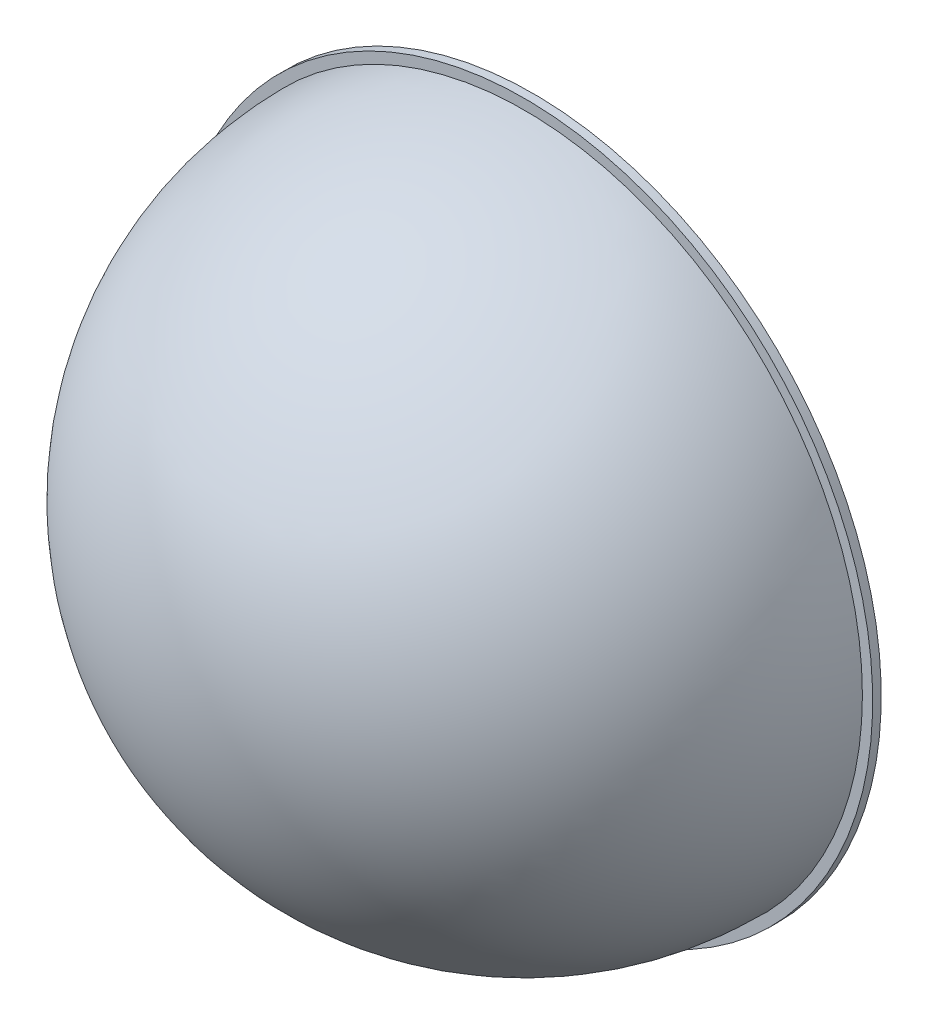
ISO-10303-21;
HEADER;
FILE_DESCRIPTION(('STEP AP214'),'2;1');
FILE_NAME('part.step','',(''),(''),'','','');
FILE_SCHEMA(('AUTOMOTIVE_DESIGN { 1 0 10303 214 1 1 1 1 }'));
ENDSEC;
DATA;
#1=APPLICATION_CONTEXT('core data for automotive mechanical design processes');
#2=APPLICATION_PROTOCOL_DEFINITION('international standard','automotive_design',2000,#1);
#3=PRODUCT_CONTEXT('',#1,'mechanical');
#4=PRODUCT('Part','Part','',(#3));
#5=PRODUCT_RELATED_PRODUCT_CATEGORY('part','',(#4));
#6=PRODUCT_DEFINITION_FORMATION('','',#4);
#7=PRODUCT_DEFINITION_CONTEXT('part definition',#1,'design');
#8=PRODUCT_DEFINITION('design','',#6,#7);
#9=PRODUCT_DEFINITION_SHAPE('','',#8);
#10=(LENGTH_UNIT() NAMED_UNIT(*) SI_UNIT(.MILLI.,.METRE.));
#11=(NAMED_UNIT(*) PLANE_ANGLE_UNIT() SI_UNIT($,.RADIAN.));
#12=(NAMED_UNIT(*) SI_UNIT($,.STERADIAN.) SOLID_ANGLE_UNIT());
#13=UNCERTAINTY_MEASURE_WITH_UNIT(LENGTH_MEASURE(1.E-05),#10,'distance_accuracy_value','');
#14=(GEOMETRIC_REPRESENTATION_CONTEXT(3) GLOBAL_UNCERTAINTY_ASSIGNED_CONTEXT((#13)) GLOBAL_UNIT_ASSIGNED_CONTEXT((#10,
#11,#12)) REPRESENTATION_CONTEXT('',''));
#15=CARTESIAN_POINT('',(0.,0.,0.));
#16=DIRECTION('',(0.,0.,1.));
#17=DIRECTION('',(1.,0.,0.));
#18=AXIS2_PLACEMENT_3D('',#15,#16,#17);
#19=CARTESIAN_POINT('',(0.,0.,0.));
#20=DIRECTION('',(0.,-1.,0.));
#21=DIRECTION('',(1.,0.,0.));
#22=AXIS2_PLACEMENT_3D('',#19,#20,#21);
#23=SPHERICAL_SURFACE('',#22,78.85);
#24=CARTESIAN_POINT('',(0.,0.,0.));
#25=DIRECTION('',(0.,0.,-1.));
#26=DIRECTION('',(-1.,0.,0.));
#27=AXIS2_PLACEMENT_3D('',#24,#25,#26);
#28=SPHERICAL_SURFACE('',#27,78.85);
#29=CARTESIAN_POINT('',(0.,0.,0.));
#30=DIRECTION('',(0.,0.,-1.));
#31=DIRECTION('',(-1.,0.,0.));
#32=AXIS2_PLACEMENT_3D('',#29,#30,#31);
#33=CIRCLE('',#32,78.85);
#34=CARTESIAN_POINT('',(-78.85,0.,3.04272323601612E-13));
#35=VERTEX_POINT('',#34);
#36=EDGE_CURVE('E10',#35,#35,#33,.T.);
#37=ORIENTED_EDGE('',*,*,#36,.F.);
#38=EDGE_LOOP('',(#37));
#39=FACE_BOUND('',#38,.T.);
#40=ADVANCED_FACE('F33',(#39),#28,.T.);
#41=CARTESIAN_POINT('',(0.,0.,0.));
#42=DIRECTION('',(0.,0.,-1.));
#43=DIRECTION('',(-1.,0.,0.));
#44=AXIS2_PLACEMENT_3D('',#41,#42,#43);
#45=PLANE('',#44);
#46=CARTESIAN_POINT('',(0.,0.,0.));
#47=DIRECTION('',(0.,0.,-1.));
#48=DIRECTION('',(-1.,0.,0.));
#49=AXIS2_PLACEMENT_3D('',#46,#47,#48);
#50=CIRCLE('',#49,81.25);
#51=CARTESIAN_POINT('',(-81.25,0.,2.83682858781005E-13));
#52=VERTEX_POINT('',#51);
#53=EDGE_CURVE('E43',#52,#52,#50,.T.);
#54=ORIENTED_EDGE('',*,*,#53,.F.);
#55=EDGE_LOOP('',(#54));
#56=FACE_BOUND('',#55,.T.);
#57=ORIENTED_EDGE('',*,*,#36,.T.);
#58=EDGE_LOOP('',(#57));
#59=FACE_BOUND('',#58,.T.);
#60=ADVANCED_FACE('F62',(#56,#59),#45,.F.);
#61=CARTESIAN_POINT('',(0.,0.,-2.));
#62=DIRECTION('',(0.,0.,-1.));
#63=DIRECTION('',(-1.,0.,0.));
#64=AXIS2_PLACEMENT_3D('',#61,#62,#63);
#65=PLANE('',#64);
#66=CARTESIAN_POINT('',(0.,0.,-2.));
#67=DIRECTION('',(0.,0.,-1.));
#68=DIRECTION('',(-1.,0.,0.));
#69=AXIS2_PLACEMENT_3D('',#66,#67,#68);
#70=CIRCLE('',#69,81.25);
#71=CARTESIAN_POINT('',(-81.25,0.,-1.99999999999972));
#72=VERTEX_POINT('',#71);
#73=EDGE_CURVE('E39',#72,#72,#70,.T.);
#74=ORIENTED_EDGE('',*,*,#73,.T.);
#75=EDGE_LOOP('',(#74));
#76=FACE_BOUND('',#75,.T.);
#77=CARTESIAN_POINT('',(0.,0.,-2.));
#78=DIRECTION('',(0.,0.,-1.));
#79=DIRECTION('',(-1.,0.,0.));
#80=AXIS2_PLACEMENT_3D('',#77,#78,#79);
#81=CIRCLE('',#80,76.85);
#82=CARTESIAN_POINT('',(-76.85,0.,-1.99999999999973));
#83=VERTEX_POINT('',#82);
#84=EDGE_CURVE('E48',#83,#83,#81,.T.);
#85=ORIENTED_EDGE('',*,*,#84,.F.);
#86=EDGE_LOOP('',(#85));
#87=FACE_BOUND('',#86,.T.);
#88=ADVANCED_FACE('F59',(#76,#87),#65,.T.);
#89=CARTESIAN_POINT('',(0.,0.,-2.));
#90=DIRECTION('',(0.,0.,1.));
#91=DIRECTION('',(1.,0.,0.));
#92=AXIS2_PLACEMENT_3D('',#89,#90,#91);
#93=CYLINDRICAL_SURFACE('',#92,81.25);
#94=ORIENTED_EDGE('',*,*,#73,.F.);
#95=EDGE_LOOP('',(#94));
#96=FACE_BOUND('',#95,.T.);
#97=ORIENTED_EDGE('',*,*,#53,.T.);
#98=EDGE_LOOP('',(#97));
#99=FACE_BOUND('',#98,.T.);
#100=ADVANCED_FACE('F61',(#96,#99),#93,.T.);
#101=CARTESIAN_POINT('',(0.,0.,-2.));
#102=DIRECTION('',(0.,0.,1.));
#103=DIRECTION('',(1.,0.,0.));
#104=AXIS2_PLACEMENT_3D('',#101,#102,#103);
#105=CYLINDRICAL_SURFACE('',#104,76.85);
#106=ORIENTED_EDGE('',*,*,#84,.T.);
#107=EDGE_LOOP('',(#106));
#108=FACE_BOUND('',#107,.T.);
#109=CARTESIAN_POINT('',(0.,0.,0.));
#110=DIRECTION('',(0.,0.,-1.));
#111=DIRECTION('',(-1.,0.,0.));
#112=AXIS2_PLACEMENT_3D('',#109,#110,#111);
#113=CIRCLE('',#112,76.85);
#114=CARTESIAN_POINT('',(-76.85,0.,2.68320340890095E-13));
#115=VERTEX_POINT('',#114);
#116=EDGE_CURVE('E50',#115,#115,#113,.T.);
#117=ORIENTED_EDGE('',*,*,#116,.F.);
#118=EDGE_LOOP('',(#117));
#119=FACE_BOUND('',#118,.T.);
#120=ADVANCED_FACE('F56',(#108,#119),#105,.F.);
#121=CARTESIAN_POINT('',(0.,0.,0.));
#122=DIRECTION('',(0.,-1.,0.));
#123=DIRECTION('',(1.,0.,0.));
#124=AXIS2_PLACEMENT_3D('',#121,#122,#123);
#125=SPHERICAL_SURFACE('',#124,76.85);
#126=CARTESIAN_POINT('',(0.,0.,0.));
#127=DIRECTION('',(0.,0.,-1.));
#128=DIRECTION('',(-1.,0.,0.));
#129=AXIS2_PLACEMENT_3D('',#126,#127,#128);
#130=SPHERICAL_SURFACE('',#129,76.85);
#131=ORIENTED_EDGE('',*,*,#116,.T.);
#132=EDGE_LOOP('',(#131));
#133=FACE_BOUND('',#132,.T.);
#134=ADVANCED_FACE('F88',(#133),#130,.F.);
#135=CLOSED_SHELL('',(#40,#60,#88,#100,#120,#134));
#136=MANIFOLD_SOLID_BREP('B2',#135);
#137=ADVANCED_BREP_SHAPE_REPRESENTATION('',(#18,#136),#14);
#138=SHAPE_DEFINITION_REPRESENTATION(#9,#137);
ENDSEC;
END-ISO-10303-21;
